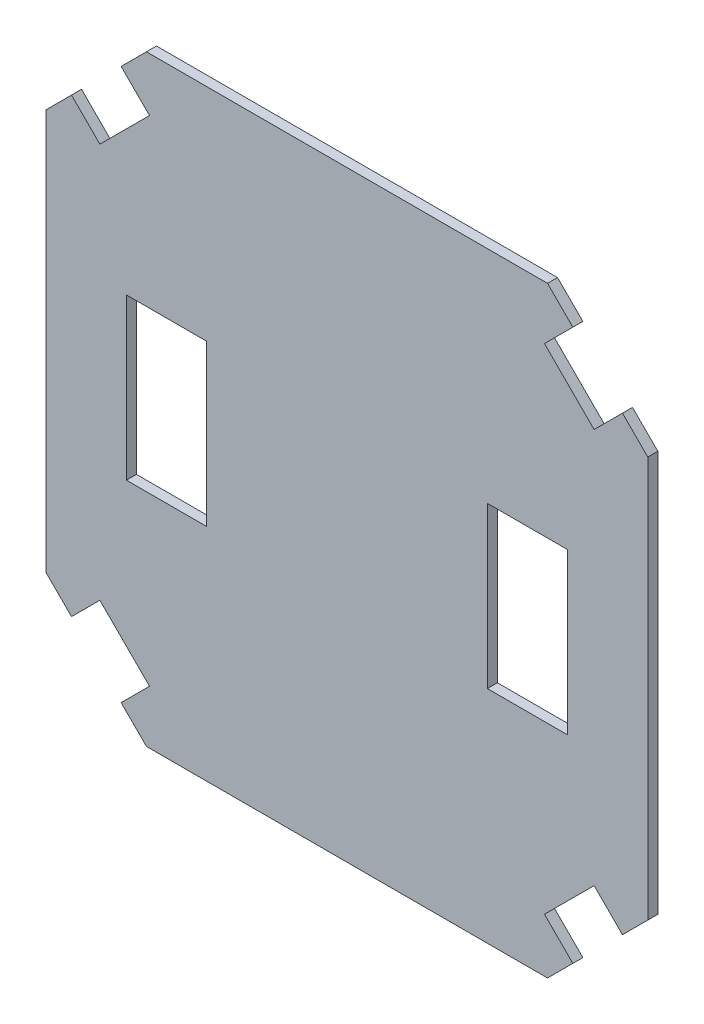
ISO-10303-21;
HEADER;
FILE_DESCRIPTION(('STEP AP214'),'2;1');
FILE_NAME('part.step','',(''),(''),'','','');
FILE_SCHEMA(('AUTOMOTIVE_DESIGN { 1 0 10303 214 1 1 1 1 }'));
ENDSEC;
DATA;
#1=APPLICATION_CONTEXT('core data for automotive mechanical design processes');
#2=APPLICATION_PROTOCOL_DEFINITION('international standard','automotive_design',2000,#1);
#3=PRODUCT_CONTEXT('',#1,'mechanical');
#4=PRODUCT('Part','Part','',(#3));
#5=PRODUCT_RELATED_PRODUCT_CATEGORY('part','',(#4));
#6=PRODUCT_DEFINITION_FORMATION('','',#4);
#7=PRODUCT_DEFINITION_CONTEXT('part definition',#1,'design');
#8=PRODUCT_DEFINITION('design','',#6,#7);
#9=PRODUCT_DEFINITION_SHAPE('','',#8);
#10=(LENGTH_UNIT() NAMED_UNIT(*) SI_UNIT(.MILLI.,.METRE.));
#11=(NAMED_UNIT(*) PLANE_ANGLE_UNIT() SI_UNIT($,.RADIAN.));
#12=(NAMED_UNIT(*) SI_UNIT($,.STERADIAN.) SOLID_ANGLE_UNIT());
#13=UNCERTAINTY_MEASURE_WITH_UNIT(LENGTH_MEASURE(1.E-05),#10,'distance_accuracy_value','');
#14=(GEOMETRIC_REPRESENTATION_CONTEXT(3) GLOBAL_UNCERTAINTY_ASSIGNED_CONTEXT((#13)) GLOBAL_UNIT_ASSIGNED_CONTEXT((#10,
#11,#12)) REPRESENTATION_CONTEXT('',''));
#15=CARTESIAN_POINT('',(0.,0.,0.));
#16=DIRECTION('',(0.,0.,1.));
#17=DIRECTION('',(1.,0.,0.));
#18=AXIS2_PLACEMENT_3D('',#15,#16,#17);
#19=CARTESIAN_POINT('',(0.,-40.,5.));
#20=DIRECTION('',(0.,1.,0.));
#21=DIRECTION('',(-1.,0.,0.));
#22=AXIS2_PLACEMENT_3D('',#19,#20,#21);
#23=PLANE('',#22);
#24=DIRECTION('',(1.,0.,0.));
#25=VECTOR('',#24,1.);
#26=CARTESIAN_POINT('',(0.,-40.,0.));
#27=LINE('',#26,#25);
#28=CARTESIAN_POINT('',(70.,-40.,0.));
#29=VERTEX_POINT('',#28);
#30=CARTESIAN_POINT('',(110.,-40.,0.));
#31=VERTEX_POINT('',#30);
#32=EDGE_CURVE('E482',#29,#31,#27,.T.);
#33=ORIENTED_EDGE('',*,*,#32,.F.);
#34=DIRECTION('',(0.,0.,-1.));
#35=VECTOR('',#34,1.);
#36=CARTESIAN_POINT('',(70.,-40.,5.));
#37=LINE('',#36,#35);
#38=CARTESIAN_POINT('',(70.,-40.,5.));
#39=VERTEX_POINT('',#38);
#40=EDGE_CURVE('E11',#39,#29,#37,.T.);
#41=ORIENTED_EDGE('',*,*,#40,.F.);
#42=DIRECTION('',(1.,0.,0.));
#43=VECTOR('',#42,1.);
#44=CARTESIAN_POINT('',(0.,-40.,5.));
#45=LINE('',#44,#43);
#46=CARTESIAN_POINT('',(110.,-40.,5.));
#47=VERTEX_POINT('',#46);
#48=EDGE_CURVE('E272',#39,#47,#45,.T.);
#49=ORIENTED_EDGE('',*,*,#48,.T.);
#50=DIRECTION('',(0.,0.,-1.));
#51=VECTOR('',#50,1.);
#52=CARTESIAN_POINT('',(110.,-40.,5.));
#53=LINE('',#52,#51);
#54=EDGE_CURVE('E61',#47,#31,#53,.T.);
#55=ORIENTED_EDGE('',*,*,#54,.T.);
#56=EDGE_LOOP('',(#33,#41,#49,#55));
#57=FACE_BOUND('',#56,.T.);
#58=ADVANCED_FACE('F41',(#57),#23,.T.);
#59=CARTESIAN_POINT('',(70.,0.,5.));
#60=DIRECTION('',(-1.,0.,0.));
#61=DIRECTION('',(0.,0.,1.));
#62=AXIS2_PLACEMENT_3D('',#59,#60,#61);
#63=PLANE('',#62);
#64=DIRECTION('',(0.,1.,0.));
#65=VECTOR('',#64,1.);
#66=CARTESIAN_POINT('',(70.,0.,0.));
#67=LINE('',#66,#65);
#68=CARTESIAN_POINT('',(70.,40.,0.));
#69=VERTEX_POINT('',#68);
#70=EDGE_CURVE('E278',#29,#69,#67,.T.);
#71=ORIENTED_EDGE('',*,*,#70,.T.);
#72=DIRECTION('',(0.,0.,-1.));
#73=VECTOR('',#72,1.);
#74=CARTESIAN_POINT('',(70.,40.,5.));
#75=LINE('',#74,#73);
#76=CARTESIAN_POINT('',(70.,40.,5.));
#77=VERTEX_POINT('',#76);
#78=EDGE_CURVE('E52',#77,#69,#75,.T.);
#79=ORIENTED_EDGE('',*,*,#78,.F.);
#80=DIRECTION('',(0.,1.,0.));
#81=VECTOR('',#80,1.);
#82=CARTESIAN_POINT('',(70.,0.,5.));
#83=LINE('',#82,#81);
#84=EDGE_CURVE('E267',#39,#77,#83,.T.);
#85=ORIENTED_EDGE('',*,*,#84,.F.);
#86=ORIENTED_EDGE('',*,*,#40,.T.);
#87=EDGE_LOOP('',(#71,#79,#85,#86));
#88=FACE_BOUND('',#87,.T.);
#89=ADVANCED_FACE('F276',(#88),#63,.F.);
#90=CARTESIAN_POINT('',(0.,40.,5.));
#91=DIRECTION('',(0.,1.,0.));
#92=DIRECTION('',(-1.,0.,0.));
#93=AXIS2_PLACEMENT_3D('',#90,#91,#92);
#94=PLANE('',#93);
#95=DIRECTION('',(1.,0.,0.));
#96=VECTOR('',#95,1.);
#97=CARTESIAN_POINT('',(0.,40.,0.));
#98=LINE('',#97,#96);
#99=CARTESIAN_POINT('',(110.,40.,0.));
#100=VERTEX_POINT('',#99);
#101=EDGE_CURVE('E487',#69,#100,#98,.T.);
#102=ORIENTED_EDGE('',*,*,#101,.T.);
#103=DIRECTION('',(0.,0.,-1.));
#104=VECTOR('',#103,1.);
#105=CARTESIAN_POINT('',(110.,40.,5.));
#106=LINE('',#105,#104);
#107=CARTESIAN_POINT('',(110.,40.,5.));
#108=VERTEX_POINT('',#107);
#109=EDGE_CURVE('E159',#108,#100,#106,.T.);
#110=ORIENTED_EDGE('',*,*,#109,.F.);
#111=DIRECTION('',(1.,0.,0.));
#112=VECTOR('',#111,1.);
#113=CARTESIAN_POINT('',(0.,40.,5.));
#114=LINE('',#113,#112);
#115=EDGE_CURVE('E258',#77,#108,#114,.T.);
#116=ORIENTED_EDGE('',*,*,#115,.F.);
#117=ORIENTED_EDGE('',*,*,#78,.T.);
#118=EDGE_LOOP('',(#102,#110,#116,#117));
#119=FACE_BOUND('',#118,.T.);
#120=ADVANCED_FACE('F260',(#119),#94,.F.);
#121=CARTESIAN_POINT('',(0.,-40.,5.));
#122=DIRECTION('',(0.,-1.,0.));
#123=DIRECTION('',(1.,0.,0.));
#124=AXIS2_PLACEMENT_3D('',#121,#122,#123);
#125=PLANE('',#124);
#126=DIRECTION('',(-1.,0.,0.));
#127=VECTOR('',#126,1.);
#128=CARTESIAN_POINT('',(0.,-40.,0.));
#129=LINE('',#128,#127);
#130=CARTESIAN_POINT('',(-70.,-40.,0.));
#131=VERTEX_POINT('',#130);
#132=CARTESIAN_POINT('',(-110.,-40.,0.));
#133=VERTEX_POINT('',#132);
#134=EDGE_CURVE('E466',#131,#133,#129,.T.);
#135=ORIENTED_EDGE('',*,*,#134,.T.);
#136=DIRECTION('',(0.,0.,-1.));
#137=VECTOR('',#136,1.);
#138=CARTESIAN_POINT('',(-110.,-40.,5.));
#139=LINE('',#138,#137);
#140=CARTESIAN_POINT('',(-110.,-40.,5.));
#141=VERTEX_POINT('',#140);
#142=EDGE_CURVE('E294',#141,#133,#139,.T.);
#143=ORIENTED_EDGE('',*,*,#142,.F.);
#144=DIRECTION('',(-1.,0.,0.));
#145=VECTOR('',#144,1.);
#146=CARTESIAN_POINT('',(0.,-40.,5.));
#147=LINE('',#146,#145);
#148=CARTESIAN_POINT('',(-70.,-40.,5.));
#149=VERTEX_POINT('',#148);
#150=EDGE_CURVE('E568',#149,#141,#147,.T.);
#151=ORIENTED_EDGE('',*,*,#150,.F.);
#152=DIRECTION('',(0.,0.,-1.));
#153=VECTOR('',#152,1.);
#154=CARTESIAN_POINT('',(-70.,-40.,5.));
#155=LINE('',#154,#153);
#156=EDGE_CURVE('E285',#149,#131,#155,.T.);
#157=ORIENTED_EDGE('',*,*,#156,.T.);
#158=EDGE_LOOP('',(#135,#143,#151,#157));
#159=FACE_BOUND('',#158,.T.);
#160=ADVANCED_FACE('F618',(#159),#125,.F.);
#161=CARTESIAN_POINT('',(-110.,0.,5.));
#162=DIRECTION('',(-1.,0.,0.));
#163=DIRECTION('',(0.,0.,1.));
#164=AXIS2_PLACEMENT_3D('',#161,#162,#163);
#165=PLANE('',#164);
#166=DIRECTION('',(0.,1.,0.));
#167=VECTOR('',#166,1.);
#168=CARTESIAN_POINT('',(-110.,0.,0.));
#169=LINE('',#168,#167);
#170=CARTESIAN_POINT('',(-110.,40.,0.));
#171=VERTEX_POINT('',#170);
#172=EDGE_CURVE('E470',#133,#171,#169,.T.);
#173=ORIENTED_EDGE('',*,*,#172,.T.);
#174=DIRECTION('',(0.,0.,-1.));
#175=VECTOR('',#174,1.);
#176=CARTESIAN_POINT('',(-110.,40.,5.));
#177=LINE('',#176,#175);
#178=CARTESIAN_POINT('',(-110.,40.,5.));
#179=VERTEX_POINT('',#178);
#180=EDGE_CURVE('E291',#179,#171,#177,.T.);
#181=ORIENTED_EDGE('',*,*,#180,.F.);
#182=DIRECTION('',(0.,1.,0.));
#183=VECTOR('',#182,1.);
#184=CARTESIAN_POINT('',(-110.,0.,5.));
#185=LINE('',#184,#183);
#186=EDGE_CURVE('E572',#141,#179,#185,.T.);
#187=ORIENTED_EDGE('',*,*,#186,.F.);
#188=ORIENTED_EDGE('',*,*,#142,.T.);
#189=EDGE_LOOP('',(#173,#181,#187,#188));
#190=FACE_BOUND('',#189,.T.);
#191=ADVANCED_FACE('F614',(#190),#165,.F.);
#192=CARTESIAN_POINT('',(0.,40.,5.));
#193=DIRECTION('',(0.,-1.,0.));
#194=DIRECTION('',(1.,0.,0.));
#195=AXIS2_PLACEMENT_3D('',#192,#193,#194);
#196=PLANE('',#195);
#197=DIRECTION('',(-1.,0.,0.));
#198=VECTOR('',#197,1.);
#199=CARTESIAN_POINT('',(0.,40.,0.));
#200=LINE('',#199,#198);
#201=CARTESIAN_POINT('',(-70.,40.,0.));
#202=VERTEX_POINT('',#201);
#203=EDGE_CURVE('E474',#202,#171,#200,.T.);
#204=ORIENTED_EDGE('',*,*,#203,.F.);
#205=DIRECTION('',(0.,0.,-1.));
#206=VECTOR('',#205,1.);
#207=CARTESIAN_POINT('',(-70.,40.,5.));
#208=LINE('',#207,#206);
#209=CARTESIAN_POINT('',(-70.,40.,5.));
#210=VERTEX_POINT('',#209);
#211=EDGE_CURVE('E288',#210,#202,#208,.T.);
#212=ORIENTED_EDGE('',*,*,#211,.F.);
#213=DIRECTION('',(-1.,0.,0.));
#214=VECTOR('',#213,1.);
#215=CARTESIAN_POINT('',(0.,40.,5.));
#216=LINE('',#215,#214);
#217=EDGE_CURVE('E575',#210,#179,#216,.T.);
#218=ORIENTED_EDGE('',*,*,#217,.T.);
#219=ORIENTED_EDGE('',*,*,#180,.T.);
#220=EDGE_LOOP('',(#204,#212,#218,#219));
#221=FACE_BOUND('',#220,.T.);
#222=ADVANCED_FACE('F611',(#221),#196,.T.);
#223=CARTESIAN_POINT('',(110.857864376269,-110.85786437627,5.));
#224=DIRECTION('',(0.707106781186543,-0.707106781186552,0.));
#225=DIRECTION('',(0.707106781186552,0.707106781186543,0.));
#226=AXIS2_PLACEMENT_3D('',#223,#224,#225);
#227=PLANE('',#226);
#228=DIRECTION('',(-0.707106781186552,-0.707106781186543,0.));
#229=VECTOR('',#228,1.);
#230=CARTESIAN_POINT('',(110.857864376269,-110.85786437627,0.));
#231=LINE('',#230,#229);
#232=CARTESIAN_POINT('',(123.232233047034,-98.4834957055048,0.));
#233=VERTEX_POINT('',#232);
#234=CARTESIAN_POINT('',(98.4834957055044,-123.232233047034,0.));
#235=VERTEX_POINT('',#234);
#236=EDGE_CURVE('E384',#233,#235,#231,.T.);
#237=ORIENTED_EDGE('',*,*,#236,.F.);
#238=DIRECTION('',(0.,0.,-1.));
#239=VECTOR('',#238,1.);
#240=CARTESIAN_POINT('',(123.232233047034,-98.4834957055048,5.));
#241=LINE('',#240,#239);
#242=CARTESIAN_POINT('',(123.232233047034,-98.4834957055048,5.));
#243=VERTEX_POINT('',#242);
#244=EDGE_CURVE('E45',#243,#233,#241,.T.);
#245=ORIENTED_EDGE('',*,*,#244,.F.);
#246=DIRECTION('',(-0.707106781186552,-0.707106781186543,0.));
#247=VECTOR('',#246,1.);
#248=CARTESIAN_POINT('',(110.857864376269,-110.85786437627,5.));
#249=LINE('',#248,#247);
#250=CARTESIAN_POINT('',(98.4834957055044,-123.232233047034,5.));
#251=VERTEX_POINT('',#250);
#252=EDGE_CURVE('E493',#243,#251,#249,.T.);
#253=ORIENTED_EDGE('',*,*,#252,.T.);
#254=DIRECTION('',(0.,0.,-1.));
#255=VECTOR('',#254,1.);
#256=CARTESIAN_POINT('',(98.4834957055044,-123.232233047034,5.));
#257=LINE('',#256,#255);
#258=EDGE_CURVE('E298',#251,#235,#257,.T.);
#259=ORIENTED_EDGE('',*,*,#258,.T.);
#260=EDGE_LOOP('',(#237,#245,#253,#259));
#261=FACE_BOUND('',#260,.T.);
#262=ADVANCED_FACE('F43',(#261),#227,.T.);
#263=CARTESIAN_POINT('',(12.3743686707649,12.3743686707648,5.));
#264=DIRECTION('',(-0.70710678118655,-0.707106781186545,0.));
#265=DIRECTION('',(0.707106781186545,-0.70710678118655,0.));
#266=AXIS2_PLACEMENT_3D('',#263,#264,#265);
#267=PLANE('',#266);
#268=DIRECTION('',(-0.707106781186545,0.70710678118655,0.));
#269=VECTOR('',#268,1.);
#270=CARTESIAN_POINT('',(12.3743686707649,12.3743686707648,0.));
#271=LINE('',#270,#269);
#272=CARTESIAN_POINT('',(137.374368670765,-112.625631329236,0.));
#273=VERTEX_POINT('',#272);
#274=EDGE_CURVE('E380',#273,#233,#271,.T.);
#275=ORIENTED_EDGE('',*,*,#274,.F.);
#276=DIRECTION('',(0.,0.,-1.));
#277=VECTOR('',#276,1.);
#278=CARTESIAN_POINT('',(137.374368670765,-112.625631329236,5.));
#279=LINE('',#278,#277);
#280=CARTESIAN_POINT('',(137.374368670765,-112.625631329236,5.));
#281=VERTEX_POINT('',#280);
#282=EDGE_CURVE('E369',#281,#273,#279,.T.);
#283=ORIENTED_EDGE('',*,*,#282,.F.);
#284=DIRECTION('',(-0.707106781186545,0.70710678118655,0.));
#285=VECTOR('',#284,1.);
#286=CARTESIAN_POINT('',(12.3743686707649,12.3743686707648,5.));
#287=LINE('',#286,#285);
#288=EDGE_CURVE('E382',#281,#243,#287,.T.);
#289=ORIENTED_EDGE('',*,*,#288,.T.);
#290=ORIENTED_EDGE('',*,*,#244,.T.);
#291=EDGE_LOOP('',(#275,#283,#289,#290));
#292=FACE_BOUND('',#291,.T.);
#293=ADVANCED_FACE('F378',(#292),#267,.T.);
#294=CARTESIAN_POINT('',(124.999999999999,-125.000000000001,5.));
#295=DIRECTION('',(-0.707106781186544,0.707106781186552,0.));
#296=DIRECTION('',(-0.707106781186551,-0.707106781186544,0.));
#297=AXIS2_PLACEMENT_3D('',#294,#295,#296);
#298=PLANE('',#297);
#299=DIRECTION('',(0.707106781186552,0.707106781186544,0.));
#300=VECTOR('',#299,1.);
#301=CARTESIAN_POINT('',(124.999999999999,-125.000000000001,0.));
#302=LINE('',#301,#300);
#303=CARTESIAN_POINT('',(150.,-100.000000000001,0.));
#304=VERTEX_POINT('',#303);
#305=EDGE_CURVE('E393',#273,#304,#302,.T.);
#306=ORIENTED_EDGE('',*,*,#305,.T.);
#307=DIRECTION('',(0.,0.,-1.));
#308=VECTOR('',#307,1.);
#309=CARTESIAN_POINT('',(150.,-100.000000000001,5.));
#310=LINE('',#309,#308);
#311=CARTESIAN_POINT('',(150.,-100.000000000001,5.));
#312=VERTEX_POINT('',#311);
#313=EDGE_CURVE('E366',#312,#304,#310,.T.);
#314=ORIENTED_EDGE('',*,*,#313,.F.);
#315=DIRECTION('',(0.707106781186552,0.707106781186544,0.));
#316=VECTOR('',#315,1.);
#317=CARTESIAN_POINT('',(124.999999999999,-125.000000000001,5.));
#318=LINE('',#317,#316);
#319=EDGE_CURVE('E500',#281,#312,#318,.T.);
#320=ORIENTED_EDGE('',*,*,#319,.F.);
#321=ORIENTED_EDGE('',*,*,#282,.T.);
#322=EDGE_LOOP('',(#306,#314,#320,#321));
#323=FACE_BOUND('',#322,.T.);
#324=ADVANCED_FACE('F627',(#323),#298,.F.);
#325=CARTESIAN_POINT('',(150.,0.,5.));
#326=DIRECTION('',(-1.,0.,0.));
#327=DIRECTION('',(0.,0.,1.));
#328=AXIS2_PLACEMENT_3D('',#325,#326,#327);
#329=PLANE('',#328);
#330=DIRECTION('',(0.,1.,0.));
#331=VECTOR('',#330,1.);
#332=CARTESIAN_POINT('',(150.,0.,0.));
#333=LINE('',#332,#331);
#334=CARTESIAN_POINT('',(150.,100.000000000001,0.));
#335=VERTEX_POINT('',#334);
#336=EDGE_CURVE('E397',#304,#335,#333,.T.);
#337=ORIENTED_EDGE('',*,*,#336,.T.);
#338=DIRECTION('',(0.,0.,-1.));
#339=VECTOR('',#338,1.);
#340=CARTESIAN_POINT('',(150.,100.000000000001,5.));
#341=LINE('',#340,#339);
#342=CARTESIAN_POINT('',(150.,100.000000000001,5.));
#343=VERTEX_POINT('',#342);
#344=EDGE_CURVE('E363',#343,#335,#341,.T.);
#345=ORIENTED_EDGE('',*,*,#344,.F.);
#346=DIRECTION('',(0.,1.,0.));
#347=VECTOR('',#346,1.);
#348=CARTESIAN_POINT('',(150.,0.,5.));
#349=LINE('',#348,#347);
#350=EDGE_CURVE('E505',#312,#343,#349,.T.);
#351=ORIENTED_EDGE('',*,*,#350,.F.);
#352=ORIENTED_EDGE('',*,*,#313,.T.);
#353=EDGE_LOOP('',(#337,#345,#351,#352));
#354=FACE_BOUND('',#353,.T.);
#355=ADVANCED_FACE('F690',(#354),#329,.F.);
#356=CARTESIAN_POINT('',(124.999999999999,125.000000000001,5.));
#357=DIRECTION('',(0.707106781186544,0.707106781186552,0.));
#358=DIRECTION('',(-0.707106781186551,0.707106781186544,0.));
#359=AXIS2_PLACEMENT_3D('',#356,#357,#358);
#360=PLANE('',#359);
#361=DIRECTION('',(0.707106781186552,-0.707106781186544,0.));
#362=VECTOR('',#361,1.);
#363=CARTESIAN_POINT('',(124.999999999999,125.000000000001,0.));
#364=LINE('',#363,#362);
#365=CARTESIAN_POINT('',(137.374368670765,112.625631329236,0.));
#366=VERTEX_POINT('',#365);
#367=EDGE_CURVE('E405',#366,#335,#364,.T.);
#368=ORIENTED_EDGE('',*,*,#367,.F.);
#369=DIRECTION('',(0.,0.,-1.));
#370=VECTOR('',#369,1.);
#371=CARTESIAN_POINT('',(137.374368670765,112.625631329236,5.));
#372=LINE('',#371,#370);
#373=CARTESIAN_POINT('',(137.374368670765,112.625631329236,5.));
#374=VERTEX_POINT('',#373);
#375=EDGE_CURVE('E360',#374,#366,#372,.T.);
#376=ORIENTED_EDGE('',*,*,#375,.F.);
#377=DIRECTION('',(0.707106781186552,-0.707106781186544,0.));
#378=VECTOR('',#377,1.);
#379=CARTESIAN_POINT('',(124.999999999999,125.000000000001,5.));
#380=LINE('',#379,#378);
#381=EDGE_CURVE('E509',#374,#343,#380,.T.);
#382=ORIENTED_EDGE('',*,*,#381,.T.);
#383=ORIENTED_EDGE('',*,*,#344,.T.);
#384=EDGE_LOOP('',(#368,#376,#382,#383));
#385=FACE_BOUND('',#384,.T.);
#386=ADVANCED_FACE('F678',(#385),#360,.T.);
#387=CARTESIAN_POINT('',(12.3743686707649,-12.3743686707648,5.));
#388=DIRECTION('',(0.70710678118655,-0.707106781186545,0.));
#389=DIRECTION('',(0.707106781186545,0.70710678118655,0.));
#390=AXIS2_PLACEMENT_3D('',#387,#388,#389);
#391=PLANE('',#390);
#392=DIRECTION('',(-0.707106781186545,-0.70710678118655,0.));
#393=VECTOR('',#392,1.);
#394=CARTESIAN_POINT('',(12.3743686707649,-12.3743686707648,0.));
#395=LINE('',#394,#393);
#396=CARTESIAN_POINT('',(123.232233047034,98.4834957055048,0.));
#397=VERTEX_POINT('',#396);
#398=EDGE_CURVE('E409',#366,#397,#395,.T.);
#399=ORIENTED_EDGE('',*,*,#398,.T.);
#400=DIRECTION('',(0.,0.,-1.));
#401=VECTOR('',#400,1.);
#402=CARTESIAN_POINT('',(123.232233047034,98.4834957055048,5.));
#403=LINE('',#402,#401);
#404=CARTESIAN_POINT('',(123.232233047034,98.4834957055048,5.));
#405=VERTEX_POINT('',#404);
#406=EDGE_CURVE('E356',#405,#397,#403,.T.);
#407=ORIENTED_EDGE('',*,*,#406,.F.);
#408=DIRECTION('',(-0.707106781186545,-0.70710678118655,0.));
#409=VECTOR('',#408,1.);
#410=CARTESIAN_POINT('',(12.3743686707649,-12.3743686707648,5.));
#411=LINE('',#410,#409);
#412=EDGE_CURVE('E513',#374,#405,#411,.T.);
#413=ORIENTED_EDGE('',*,*,#412,.F.);
#414=ORIENTED_EDGE('',*,*,#375,.T.);
#415=EDGE_LOOP('',(#399,#407,#413,#414));
#416=FACE_BOUND('',#415,.T.);
#417=ADVANCED_FACE('F685',(#416),#391,.F.);
#418=CARTESIAN_POINT('',(110.857864376269,110.85786437627,5.));
#419=DIRECTION('',(-0.707106781186543,-0.707106781186552,0.));
#420=DIRECTION('',(0.707106781186552,-0.707106781186543,0.));
#421=AXIS2_PLACEMENT_3D('',#418,#419,#420);
#422=PLANE('',#421);
#423=DIRECTION('',(-0.707106781186552,0.707106781186543,0.));
#424=VECTOR('',#423,1.);
#425=CARTESIAN_POINT('',(110.857864376269,110.85786437627,0.));
#426=LINE('',#425,#424);
#427=CARTESIAN_POINT('',(98.4834957055045,123.232233047034,0.));
#428=VERTEX_POINT('',#427);
#429=EDGE_CURVE('E413',#397,#428,#426,.T.);
#430=ORIENTED_EDGE('',*,*,#429,.T.);
#431=DIRECTION('',(0.,0.,-1.));
#432=VECTOR('',#431,1.);
#433=CARTESIAN_POINT('',(98.4834957055045,123.232233047034,5.));
#434=LINE('',#433,#432);
#435=CARTESIAN_POINT('',(98.4834957055045,123.232233047034,5.));
#436=VERTEX_POINT('',#435);
#437=EDGE_CURVE('E352',#436,#428,#434,.T.);
#438=ORIENTED_EDGE('',*,*,#437,.F.);
#439=DIRECTION('',(-0.707106781186552,0.707106781186543,0.));
#440=VECTOR('',#439,1.);
#441=CARTESIAN_POINT('',(110.857864376269,110.85786437627,5.));
#442=LINE('',#441,#440);
#443=EDGE_CURVE('E517',#405,#436,#442,.T.);
#444=ORIENTED_EDGE('',*,*,#443,.F.);
#445=ORIENTED_EDGE('',*,*,#406,.T.);
#446=EDGE_LOOP('',(#430,#438,#444,#445));
#447=FACE_BOUND('',#446,.T.);
#448=ADVANCED_FACE('F681',(#447),#422,.F.);
#449=CARTESIAN_POINT('',(-12.3743686707643,12.3743686707642,5.));
#450=DIRECTION('',(-0.707106781186551,0.707106781186544,0.));
#451=DIRECTION('',(-0.707106781186544,-0.707106781186551,0.));
#452=AXIS2_PLACEMENT_3D('',#449,#450,#451);
#453=PLANE('',#452);
#454=DIRECTION('',(0.707106781186544,0.707106781186551,0.));
#455=VECTOR('',#454,1.);
#456=CARTESIAN_POINT('',(-12.3743686707643,12.3743686707642,0.));
#457=LINE('',#456,#455);
#458=CARTESIAN_POINT('',(112.625631329235,137.374368670765,0.));
#459=VERTEX_POINT('',#458);
#460=EDGE_CURVE('E416',#428,#459,#457,.T.);
#461=ORIENTED_EDGE('',*,*,#460,.T.);
#462=DIRECTION('',(0.,0.,-1.));
#463=VECTOR('',#462,1.);
#464=CARTESIAN_POINT('',(112.625631329235,137.374368670765,5.));
#465=LINE('',#464,#463);
#466=CARTESIAN_POINT('',(112.625631329235,137.374368670765,5.));
#467=VERTEX_POINT('',#466);
#468=EDGE_CURVE('E349',#467,#459,#465,.T.);
#469=ORIENTED_EDGE('',*,*,#468,.F.);
#470=DIRECTION('',(0.707106781186544,0.707106781186551,0.));
#471=VECTOR('',#470,1.);
#472=CARTESIAN_POINT('',(-12.3743686707643,12.3743686707642,5.));
#473=LINE('',#472,#471);
#474=EDGE_CURVE('E520',#436,#467,#473,.T.);
#475=ORIENTED_EDGE('',*,*,#474,.F.);
#476=ORIENTED_EDGE('',*,*,#437,.T.);
#477=EDGE_LOOP('',(#461,#469,#475,#476));
#478=FACE_BOUND('',#477,.T.);
#479=ADVANCED_FACE('F676',(#478),#453,.F.);
#480=CARTESIAN_POINT('',(100.,150.,0.));
#481=VERTEX_POINT('',#480);
#482=EDGE_CURVE('E410',#481,#459,#364,.T.);
#483=ORIENTED_EDGE('',*,*,#482,.F.);
#484=DIRECTION('',(0.,0.,-1.));
#485=VECTOR('',#484,1.);
#486=CARTESIAN_POINT('',(100.,150.,5.));
#487=LINE('',#486,#485);
#488=CARTESIAN_POINT('',(100.,150.,5.));
#489=VERTEX_POINT('',#488);
#490=EDGE_CURVE('E346',#489,#481,#487,.T.);
#491=ORIENTED_EDGE('',*,*,#490,.F.);
#492=EDGE_CURVE('E514',#489,#467,#380,.T.);
#493=ORIENTED_EDGE('',*,*,#492,.T.);
#494=ORIENTED_EDGE('',*,*,#468,.T.);
#495=EDGE_LOOP('',(#483,#491,#493,#494));
#496=FACE_BOUND('',#495,.T.);
#497=ADVANCED_FACE('F672',(#496),#360,.T.);
#498=CARTESIAN_POINT('',(0.,150.,5.));
#499=DIRECTION('',(0.,-1.,0.));
#500=DIRECTION('',(1.,0.,0.));
#501=AXIS2_PLACEMENT_3D('',#498,#499,#500);
#502=PLANE('',#501);
#503=DIRECTION('',(-1.,0.,0.));
#504=VECTOR('',#503,1.);
#505=CARTESIAN_POINT('',(0.,150.,0.));
#506=LINE('',#505,#504);
#507=CARTESIAN_POINT('',(-100.,150.,0.));
#508=VERTEX_POINT('',#507);
#509=EDGE_CURVE('E420',#481,#508,#506,.T.);
#510=ORIENTED_EDGE('',*,*,#509,.T.);
#511=DIRECTION('',(0.,0.,-1.));
#512=VECTOR('',#511,1.);
#513=CARTESIAN_POINT('',(-100.,150.,5.));
#514=LINE('',#513,#512);
#515=CARTESIAN_POINT('',(-100.,150.,5.));
#516=VERTEX_POINT('',#515);
#517=EDGE_CURVE('E342',#516,#508,#514,.T.);
#518=ORIENTED_EDGE('',*,*,#517,.F.);
#519=DIRECTION('',(-1.,0.,0.));
#520=VECTOR('',#519,1.);
#521=CARTESIAN_POINT('',(0.,150.,5.));
#522=LINE('',#521,#520);
#523=EDGE_CURVE('E523',#489,#516,#522,.T.);
#524=ORIENTED_EDGE('',*,*,#523,.F.);
#525=ORIENTED_EDGE('',*,*,#490,.T.);
#526=EDGE_LOOP('',(#510,#518,#524,#525));
#527=FACE_BOUND('',#526,.T.);
#528=ADVANCED_FACE('F669',(#527),#502,.F.);
#529=CARTESIAN_POINT('',(-124.999999999999,125.000000000001,5.));
#530=DIRECTION('',(0.707106781186543,-0.707106781186552,0.));
#531=DIRECTION('',(0.707106781186552,0.707106781186543,0.));
#532=AXIS2_PLACEMENT_3D('',#529,#530,#531);
#533=PLANE('',#532);
#534=DIRECTION('',(-0.707106781186552,-0.707106781186543,0.));
#535=VECTOR('',#534,1.);
#536=CARTESIAN_POINT('',(-124.999999999999,125.000000000001,0.));
#537=LINE('',#536,#535);
#538=CARTESIAN_POINT('',(-112.625631329235,137.374368670765,0.));
#539=VERTEX_POINT('',#538);
#540=EDGE_CURVE('E423',#508,#539,#537,.T.);
#541=ORIENTED_EDGE('',*,*,#540,.T.);
#542=DIRECTION('',(0.,0.,-1.));
#543=VECTOR('',#542,1.);
#544=CARTESIAN_POINT('',(-112.625631329235,137.374368670765,5.));
#545=LINE('',#544,#543);
#546=CARTESIAN_POINT('',(-112.625631329235,137.374368670765,5.));
#547=VERTEX_POINT('',#546);
#548=EDGE_CURVE('E339',#547,#539,#545,.T.);
#549=ORIENTED_EDGE('',*,*,#548,.F.);
#550=DIRECTION('',(-0.707106781186552,-0.707106781186543,0.));
#551=VECTOR('',#550,1.);
#552=CARTESIAN_POINT('',(-124.999999999999,125.000000000001,5.));
#553=LINE('',#552,#551);
#554=EDGE_CURVE('E526',#516,#547,#553,.T.);
#555=ORIENTED_EDGE('',*,*,#554,.F.);
#556=ORIENTED_EDGE('',*,*,#517,.T.);
#557=EDGE_LOOP('',(#541,#549,#555,#556));
#558=FACE_BOUND('',#557,.T.);
#559=ADVANCED_FACE('F657',(#558),#533,.F.);
#560=CARTESIAN_POINT('',(12.3743686707643,12.3743686707642,5.));
#561=DIRECTION('',(-0.707106781186551,-0.707106781186544,0.));
#562=DIRECTION('',(0.707106781186544,-0.707106781186551,0.));
#563=AXIS2_PLACEMENT_3D('',#560,#561,#562);
#564=PLANE('',#563);
#565=DIRECTION('',(-0.707106781186544,0.707106781186551,0.));
#566=VECTOR('',#565,1.);
#567=CARTESIAN_POINT('',(12.3743686707643,12.3743686707642,0.));
#568=LINE('',#567,#566);
#569=CARTESIAN_POINT('',(-98.4834957055044,123.232233047034,0.));
#570=VERTEX_POINT('',#569);
#571=EDGE_CURVE('E427',#570,#539,#568,.T.);
#572=ORIENTED_EDGE('',*,*,#571,.F.);
#573=DIRECTION('',(0.,0.,-1.));
#574=VECTOR('',#573,1.);
#575=CARTESIAN_POINT('',(-98.4834957055044,123.232233047034,5.));
#576=LINE('',#575,#574);
#577=CARTESIAN_POINT('',(-98.4834957055044,123.232233047034,5.));
#578=VERTEX_POINT('',#577);
#579=EDGE_CURVE('E336',#578,#570,#576,.T.);
#580=ORIENTED_EDGE('',*,*,#579,.F.);
#581=DIRECTION('',(-0.707106781186544,0.707106781186551,0.));
#582=VECTOR('',#581,1.);
#583=CARTESIAN_POINT('',(12.3743686707643,12.3743686707642,5.));
#584=LINE('',#583,#582);
#585=EDGE_CURVE('E529',#578,#547,#584,.T.);
#586=ORIENTED_EDGE('',*,*,#585,.T.);
#587=ORIENTED_EDGE('',*,*,#548,.T.);
#588=EDGE_LOOP('',(#572,#580,#586,#587));
#589=FACE_BOUND('',#588,.T.);
#590=ADVANCED_FACE('F664',(#589),#564,.T.);
#591=CARTESIAN_POINT('',(-110.857864376268,110.857864376271,5.));
#592=DIRECTION('',(-0.707106781186539,0.707106781186556,0.));
#593=DIRECTION('',(-0.707106781186556,-0.707106781186539,0.));
#594=AXIS2_PLACEMENT_3D('',#591,#592,#593);
#595=PLANE('',#594);
#596=DIRECTION('',(0.707106781186556,0.707106781186539,0.));
#597=VECTOR('',#596,1.);
#598=CARTESIAN_POINT('',(-110.857864376268,110.857864376271,0.));
#599=LINE('',#598,#597);
#600=CARTESIAN_POINT('',(-123.232233047033,98.4834957055056,0.));
#601=VERTEX_POINT('',#600);
#602=EDGE_CURVE('E432',#601,#570,#599,.T.);
#603=ORIENTED_EDGE('',*,*,#602,.F.);
#604=DIRECTION('',(0.,0.,-1.));
#605=VECTOR('',#604,1.);
#606=CARTESIAN_POINT('',(-123.232233047033,98.4834957055056,5.));
#607=LINE('',#606,#605);
#608=CARTESIAN_POINT('',(-123.232233047033,98.4834957055056,5.));
#609=VERTEX_POINT('',#608);
#610=EDGE_CURVE('E333',#609,#601,#607,.T.);
#611=ORIENTED_EDGE('',*,*,#610,.F.);
#612=DIRECTION('',(0.707106781186556,0.707106781186539,0.));
#613=VECTOR('',#612,1.);
#614=CARTESIAN_POINT('',(-110.857864376268,110.857864376271,5.));
#615=LINE('',#614,#613);
#616=EDGE_CURVE('E534',#609,#578,#615,.T.);
#617=ORIENTED_EDGE('',*,*,#616,.T.);
#618=ORIENTED_EDGE('',*,*,#579,.T.);
#619=EDGE_LOOP('',(#603,#611,#617,#618));
#620=FACE_BOUND('',#619,.T.);
#621=ADVANCED_FACE('F660',(#620),#595,.T.);
#622=CARTESIAN_POINT('',(-12.3743686707646,-12.3743686707644,5.));
#623=DIRECTION('',(0.707106781186552,0.707106781186543,0.));
#624=DIRECTION('',(-0.707106781186543,0.707106781186552,0.));
#625=AXIS2_PLACEMENT_3D('',#622,#623,#624);
#626=PLANE('',#625);
#627=DIRECTION('',(0.707106781186543,-0.707106781186552,0.));
#628=VECTOR('',#627,1.);
#629=CARTESIAN_POINT('',(-12.3743686707646,-12.3743686707644,0.));
#630=LINE('',#629,#628);
#631=CARTESIAN_POINT('',(-137.374368670764,112.625631329237,0.));
#632=VERTEX_POINT('',#631);
#633=EDGE_CURVE('E436',#632,#601,#630,.T.);
#634=ORIENTED_EDGE('',*,*,#633,.F.);
#635=DIRECTION('',(0.,0.,-1.));
#636=VECTOR('',#635,1.);
#637=CARTESIAN_POINT('',(-137.374368670764,112.625631329237,5.));
#638=LINE('',#637,#636);
#639=CARTESIAN_POINT('',(-137.374368670764,112.625631329237,5.));
#640=VERTEX_POINT('',#639);
#641=EDGE_CURVE('E330',#640,#632,#638,.T.);
#642=ORIENTED_EDGE('',*,*,#641,.F.);
#643=DIRECTION('',(0.707106781186543,-0.707106781186552,0.));
#644=VECTOR('',#643,1.);
#645=CARTESIAN_POINT('',(-12.3743686707646,-12.3743686707644,5.));
#646=LINE('',#645,#644);
#647=EDGE_CURVE('E538',#640,#609,#646,.T.);
#648=ORIENTED_EDGE('',*,*,#647,.T.);
#649=ORIENTED_EDGE('',*,*,#610,.T.);
#650=EDGE_LOOP('',(#634,#642,#648,#649));
#651=FACE_BOUND('',#650,.T.);
#652=ADVANCED_FACE('F655',(#651),#626,.T.);
#653=CARTESIAN_POINT('',(-150.,100.000000000001,0.));
#654=VERTEX_POINT('',#653);
#655=EDGE_CURVE('E428',#632,#654,#537,.T.);
#656=ORIENTED_EDGE('',*,*,#655,.T.);
#657=DIRECTION('',(0.,0.,-1.));
#658=VECTOR('',#657,1.);
#659=CARTESIAN_POINT('',(-150.,100.000000000001,5.));
#660=LINE('',#659,#658);
#661=CARTESIAN_POINT('',(-150.,100.000000000001,5.));
#662=VERTEX_POINT('',#661);
#663=EDGE_CURVE('E327',#662,#654,#660,.T.);
#664=ORIENTED_EDGE('',*,*,#663,.F.);
#665=EDGE_CURVE('E530',#640,#662,#553,.T.);
#666=ORIENTED_EDGE('',*,*,#665,.F.);
#667=ORIENTED_EDGE('',*,*,#641,.T.);
#668=EDGE_LOOP('',(#656,#664,#666,#667));
#669=FACE_BOUND('',#668,.T.);
#670=ADVANCED_FACE('F651',(#669),#533,.F.);
#671=CARTESIAN_POINT('',(-150.,0.,5.));
#672=DIRECTION('',(-1.,0.,0.));
#673=DIRECTION('',(0.,0.,1.));
#674=AXIS2_PLACEMENT_3D('',#671,#672,#673);
#675=PLANE('',#674);
#676=DIRECTION('',(0.,1.,0.));
#677=VECTOR('',#676,1.);
#678=CARTESIAN_POINT('',(-150.,0.,0.));
#679=LINE('',#678,#677);
#680=CARTESIAN_POINT('',(-150.,-100.000000000001,0.));
#681=VERTEX_POINT('',#680);
#682=EDGE_CURVE('E440',#681,#654,#679,.T.);
#683=ORIENTED_EDGE('',*,*,#682,.F.);
#684=DIRECTION('',(0.,0.,-1.));
#685=VECTOR('',#684,1.);
#686=CARTESIAN_POINT('',(-150.,-100.000000000001,5.));
#687=LINE('',#686,#685);
#688=CARTESIAN_POINT('',(-150.,-100.000000000001,5.));
#689=VERTEX_POINT('',#688);
#690=EDGE_CURVE('E324',#689,#681,#687,.T.);
#691=ORIENTED_EDGE('',*,*,#690,.F.);
#692=DIRECTION('',(0.,1.,0.));
#693=VECTOR('',#692,1.);
#694=CARTESIAN_POINT('',(-150.,0.,5.));
#695=LINE('',#694,#693);
#696=EDGE_CURVE('E542',#689,#662,#695,.T.);
#697=ORIENTED_EDGE('',*,*,#696,.T.);
#698=ORIENTED_EDGE('',*,*,#663,.T.);
#699=EDGE_LOOP('',(#683,#691,#697,#698));
#700=FACE_BOUND('',#699,.T.);
#701=ADVANCED_FACE('F648',(#700),#675,.T.);
#702=CARTESIAN_POINT('',(-124.999999999999,-125.000000000001,5.));
#703=DIRECTION('',(-0.707106781186543,-0.707106781186552,0.));
#704=DIRECTION('',(0.707106781186552,-0.707106781186543,0.));
#705=AXIS2_PLACEMENT_3D('',#702,#703,#704);
#706=PLANE('',#705);
#707=DIRECTION('',(-0.707106781186552,0.707106781186543,0.));
#708=VECTOR('',#707,1.);
#709=CARTESIAN_POINT('',(-124.999999999999,-125.000000000001,0.));
#710=LINE('',#709,#708);
#711=CARTESIAN_POINT('',(-137.374368670765,-112.625631329236,0.));
#712=VERTEX_POINT('',#711);
#713=EDGE_CURVE('E444',#712,#681,#710,.T.);
#714=ORIENTED_EDGE('',*,*,#713,.F.);
#715=DIRECTION('',(0.,0.,-1.));
#716=VECTOR('',#715,1.);
#717=CARTESIAN_POINT('',(-137.374368670765,-112.625631329236,5.));
#718=LINE('',#717,#716);
#719=CARTESIAN_POINT('',(-137.374368670765,-112.625631329236,5.));
#720=VERTEX_POINT('',#719);
#721=EDGE_CURVE('E321',#720,#712,#718,.T.);
#722=ORIENTED_EDGE('',*,*,#721,.F.);
#723=DIRECTION('',(-0.707106781186552,0.707106781186543,0.));
#724=VECTOR('',#723,1.);
#725=CARTESIAN_POINT('',(-124.999999999999,-125.000000000001,5.));
#726=LINE('',#725,#724);
#727=EDGE_CURVE('E546',#720,#689,#726,.T.);
#728=ORIENTED_EDGE('',*,*,#727,.T.);
#729=ORIENTED_EDGE('',*,*,#690,.T.);
#730=EDGE_LOOP('',(#714,#722,#728,#729));
#731=FACE_BOUND('',#730,.T.);
#732=ADVANCED_FACE('F636',(#731),#706,.T.);
#733=CARTESIAN_POINT('',(-12.3743686707644,12.3743686707644,5.));
#734=DIRECTION('',(-0.707106781186547,0.707106781186548,0.));
#735=DIRECTION('',(-0.707106781186548,-0.707106781186547,0.));
#736=AXIS2_PLACEMENT_3D('',#733,#734,#735);
#737=PLANE('',#736);
#738=DIRECTION('',(0.707106781186548,0.707106781186547,0.));
#739=VECTOR('',#738,1.);
#740=CARTESIAN_POINT('',(-12.3743686707644,12.3743686707644,0.));
#741=LINE('',#740,#739);
#742=CARTESIAN_POINT('',(-123.232233047034,-98.4834957055048,0.));
#743=VERTEX_POINT('',#742);
#744=EDGE_CURVE('E448',#712,#743,#741,.T.);
#745=ORIENTED_EDGE('',*,*,#744,.T.);
#746=DIRECTION('',(0.,0.,-1.));
#747=VECTOR('',#746,1.);
#748=CARTESIAN_POINT('',(-123.232233047034,-98.4834957055048,5.));
#749=LINE('',#748,#747);
#750=CARTESIAN_POINT('',(-123.232233047034,-98.4834957055048,5.));
#751=VERTEX_POINT('',#750);
#752=EDGE_CURVE('E317',#751,#743,#749,.T.);
#753=ORIENTED_EDGE('',*,*,#752,.F.);
#754=DIRECTION('',(0.707106781186548,0.707106781186547,0.));
#755=VECTOR('',#754,1.);
#756=CARTESIAN_POINT('',(-12.3743686707644,12.3743686707644,5.));
#757=LINE('',#756,#755);
#758=EDGE_CURVE('E550',#720,#751,#757,.T.);
#759=ORIENTED_EDGE('',*,*,#758,.F.);
#760=ORIENTED_EDGE('',*,*,#721,.T.);
#761=EDGE_LOOP('',(#745,#753,#759,#760));
#762=FACE_BOUND('',#761,.T.);
#763=ADVANCED_FACE('F643',(#762),#737,.F.);
#764=CARTESIAN_POINT('',(-110.857864376269,-110.85786437627,5.));
#765=DIRECTION('',(0.707106781186544,0.707106781186551,0.));
#766=DIRECTION('',(-0.707106781186551,0.707106781186544,0.));
#767=AXIS2_PLACEMENT_3D('',#764,#765,#766);
#768=PLANE('',#767);
#769=DIRECTION('',(0.707106781186551,-0.707106781186544,0.));
#770=VECTOR('',#769,1.);
#771=CARTESIAN_POINT('',(-110.857864376269,-110.85786437627,0.));
#772=LINE('',#771,#770);
#773=CARTESIAN_POINT('',(-98.4834957055044,-123.232233047034,0.));
#774=VERTEX_POINT('',#773);
#775=EDGE_CURVE('E452',#743,#774,#772,.T.);
#776=ORIENTED_EDGE('',*,*,#775,.T.);
#777=DIRECTION('',(0.,0.,-1.));
#778=VECTOR('',#777,1.);
#779=CARTESIAN_POINT('',(-98.4834957055044,-123.232233047034,5.));
#780=LINE('',#779,#778);
#781=CARTESIAN_POINT('',(-98.4834957055044,-123.232233047034,5.));
#782=VERTEX_POINT('',#781);
#783=EDGE_CURVE('E313',#782,#774,#780,.T.);
#784=ORIENTED_EDGE('',*,*,#783,.F.);
#785=DIRECTION('',(0.707106781186551,-0.707106781186544,0.));
#786=VECTOR('',#785,1.);
#787=CARTESIAN_POINT('',(-110.857864376269,-110.85786437627,5.));
#788=LINE('',#787,#786);
#789=EDGE_CURVE('E554',#751,#782,#788,.T.);
#790=ORIENTED_EDGE('',*,*,#789,.F.);
#791=ORIENTED_EDGE('',*,*,#752,.T.);
#792=EDGE_LOOP('',(#776,#784,#790,#791));
#793=FACE_BOUND('',#792,.T.);
#794=ADVANCED_FACE('F639',(#793),#768,.F.);
#795=CARTESIAN_POINT('',(12.3743686707643,-12.3743686707642,5.));
#796=DIRECTION('',(0.707106781186551,-0.707106781186544,0.));
#797=DIRECTION('',(0.707106781186544,0.707106781186551,0.));
#798=AXIS2_PLACEMENT_3D('',#795,#796,#797);
#799=PLANE('',#798);
#800=DIRECTION('',(-0.707106781186544,-0.707106781186551,0.));
#801=VECTOR('',#800,1.);
#802=CARTESIAN_POINT('',(12.3743686707643,-12.3743686707642,0.));
#803=LINE('',#802,#801);
#804=CARTESIAN_POINT('',(-112.625631329235,-137.374368670765,0.));
#805=VERTEX_POINT('',#804);
#806=EDGE_CURVE('E455',#774,#805,#803,.T.);
#807=ORIENTED_EDGE('',*,*,#806,.T.);
#808=DIRECTION('',(0.,0.,-1.));
#809=VECTOR('',#808,1.);
#810=CARTESIAN_POINT('',(-112.625631329235,-137.374368670765,5.));
#811=LINE('',#810,#809);
#812=CARTESIAN_POINT('',(-112.625631329235,-137.374368670765,5.));
#813=VERTEX_POINT('',#812);
#814=EDGE_CURVE('E310',#813,#805,#811,.T.);
#815=ORIENTED_EDGE('',*,*,#814,.F.);
#816=DIRECTION('',(-0.707106781186544,-0.707106781186551,0.));
#817=VECTOR('',#816,1.);
#818=CARTESIAN_POINT('',(12.3743686707643,-12.3743686707642,5.));
#819=LINE('',#818,#817);
#820=EDGE_CURVE('E557',#782,#813,#819,.T.);
#821=ORIENTED_EDGE('',*,*,#820,.F.);
#822=ORIENTED_EDGE('',*,*,#783,.T.);
#823=EDGE_LOOP('',(#807,#815,#821,#822));
#824=FACE_BOUND('',#823,.T.);
#825=ADVANCED_FACE('F634',(#824),#799,.F.);
#826=CARTESIAN_POINT('',(-100.,-150.,0.));
#827=VERTEX_POINT('',#826);
#828=EDGE_CURVE('E449',#827,#805,#710,.T.);
#829=ORIENTED_EDGE('',*,*,#828,.F.);
#830=DIRECTION('',(0.,0.,-1.));
#831=VECTOR('',#830,1.);
#832=CARTESIAN_POINT('',(-100.,-150.,5.));
#833=LINE('',#832,#831);
#834=CARTESIAN_POINT('',(-100.,-150.,5.));
#835=VERTEX_POINT('',#834);
#836=EDGE_CURVE('E307',#835,#827,#833,.T.);
#837=ORIENTED_EDGE('',*,*,#836,.F.);
#838=EDGE_CURVE('E551',#835,#813,#726,.T.);
#839=ORIENTED_EDGE('',*,*,#838,.T.);
#840=ORIENTED_EDGE('',*,*,#814,.T.);
#841=EDGE_LOOP('',(#829,#837,#839,#840));
#842=FACE_BOUND('',#841,.T.);
#843=ADVANCED_FACE('F630',(#842),#706,.T.);
#844=CARTESIAN_POINT('',(0.,-150.,5.));
#845=DIRECTION('',(0.,-1.,0.));
#846=DIRECTION('',(1.,0.,0.));
#847=AXIS2_PLACEMENT_3D('',#844,#845,#846);
#848=PLANE('',#847);
#849=DIRECTION('',(-1.,0.,0.));
#850=VECTOR('',#849,1.);
#851=CARTESIAN_POINT('',(0.,-150.,0.));
#852=LINE('',#851,#850);
#853=CARTESIAN_POINT('',(100.,-150.,0.));
#854=VERTEX_POINT('',#853);
#855=EDGE_CURVE('E459',#854,#827,#852,.T.);
#856=ORIENTED_EDGE('',*,*,#855,.F.);
#857=DIRECTION('',(0.,0.,-1.));
#858=VECTOR('',#857,1.);
#859=CARTESIAN_POINT('',(100.,-150.,5.));
#860=LINE('',#859,#858);
#861=CARTESIAN_POINT('',(100.,-150.,5.));
#862=VERTEX_POINT('',#861);
#863=EDGE_CURVE('E304',#862,#854,#860,.T.);
#864=ORIENTED_EDGE('',*,*,#863,.F.);
#865=DIRECTION('',(-1.,0.,0.));
#866=VECTOR('',#865,1.);
#867=CARTESIAN_POINT('',(0.,-150.,5.));
#868=LINE('',#867,#866);
#869=EDGE_CURVE('E560',#862,#835,#868,.T.);
#870=ORIENTED_EDGE('',*,*,#869,.T.);
#871=ORIENTED_EDGE('',*,*,#836,.T.);
#872=EDGE_LOOP('',(#856,#864,#870,#871));
#873=FACE_BOUND('',#872,.T.);
#874=ADVANCED_FACE('F625',(#873),#848,.T.);
#875=CARTESIAN_POINT('',(112.625631329235,-137.374368670765,0.));
#876=VERTEX_POINT('',#875);
#877=EDGE_CURVE('E399',#854,#876,#302,.T.);
#878=ORIENTED_EDGE('',*,*,#877,.T.);
#879=DIRECTION('',(0.,0.,-1.));
#880=VECTOR('',#879,1.);
#881=CARTESIAN_POINT('',(112.625631329235,-137.374368670765,5.));
#882=LINE('',#881,#880);
#883=CARTESIAN_POINT('',(112.625631329235,-137.374368670765,5.));
#884=VERTEX_POINT('',#883);
#885=EDGE_CURVE('E301',#884,#876,#882,.T.);
#886=ORIENTED_EDGE('',*,*,#885,.F.);
#887=EDGE_CURVE('E506',#862,#884,#318,.T.);
#888=ORIENTED_EDGE('',*,*,#887,.F.);
#889=ORIENTED_EDGE('',*,*,#863,.T.);
#890=EDGE_LOOP('',(#878,#886,#888,#889));
#891=FACE_BOUND('',#890,.T.);
#892=ADVANCED_FACE('F609',(#891),#298,.F.);
#893=CARTESIAN_POINT('',(-70.,0.,5.));
#894=DIRECTION('',(-1.,0.,0.));
#895=DIRECTION('',(0.,0.,1.));
#896=AXIS2_PLACEMENT_3D('',#893,#894,#895);
#897=PLANE('',#896);
#898=DIRECTION('',(0.,1.,0.));
#899=VECTOR('',#898,1.);
#900=CARTESIAN_POINT('',(-70.,0.,0.));
#901=LINE('',#900,#899);
#902=EDGE_CURVE('E478',#131,#202,#901,.T.);
#903=ORIENTED_EDGE('',*,*,#902,.F.);
#904=ORIENTED_EDGE('',*,*,#156,.F.);
#905=DIRECTION('',(0.,1.,0.));
#906=VECTOR('',#905,1.);
#907=CARTESIAN_POINT('',(-70.,0.,5.));
#908=LINE('',#907,#906);
#909=EDGE_CURVE('E579',#149,#210,#908,.T.);
#910=ORIENTED_EDGE('',*,*,#909,.T.);
#911=ORIENTED_EDGE('',*,*,#211,.T.);
#912=EDGE_LOOP('',(#903,#904,#910,#911));
#913=FACE_BOUND('',#912,.T.);
#914=ADVANCED_FACE('F595',(#913),#897,.T.);
#915=CARTESIAN_POINT('',(-12.3743686707643,-12.3743686707642,5.));
#916=DIRECTION('',(0.707106781186551,0.707106781186544,0.));
#917=DIRECTION('',(-0.707106781186544,0.707106781186551,0.));
#918=AXIS2_PLACEMENT_3D('',#915,#916,#917);
#919=PLANE('',#918);
#920=DIRECTION('',(0.707106781186544,-0.707106781186551,0.));
#921=VECTOR('',#920,1.);
#922=CARTESIAN_POINT('',(-12.3743686707643,-12.3743686707642,0.));
#923=LINE('',#922,#921);
#924=EDGE_CURVE('E463',#235,#876,#923,.T.);
#925=ORIENTED_EDGE('',*,*,#924,.F.);
#926=ORIENTED_EDGE('',*,*,#258,.F.);
#927=DIRECTION('',(0.707106781186544,-0.707106781186551,0.));
#928=VECTOR('',#927,1.);
#929=CARTESIAN_POINT('',(-12.3743686707643,-12.3743686707642,5.));
#930=LINE('',#929,#928);
#931=EDGE_CURVE('E564',#251,#884,#930,.T.);
#932=ORIENTED_EDGE('',*,*,#931,.T.);
#933=ORIENTED_EDGE('',*,*,#885,.T.);
#934=EDGE_LOOP('',(#925,#926,#932,#933));
#935=FACE_BOUND('',#934,.T.);
#936=ADVANCED_FACE('F587',(#935),#919,.T.);
#937=CARTESIAN_POINT('',(110.,0.,5.));
#938=DIRECTION('',(-1.,0.,0.));
#939=DIRECTION('',(0.,0.,1.));
#940=AXIS2_PLACEMENT_3D('',#937,#938,#939);
#941=PLANE('',#940);
#942=DIRECTION('',(0.,1.,0.));
#943=VECTOR('',#942,1.);
#944=CARTESIAN_POINT('',(110.,0.,0.));
#945=LINE('',#944,#943);
#946=EDGE_CURVE('E490',#31,#100,#945,.T.);
#947=ORIENTED_EDGE('',*,*,#946,.F.);
#948=ORIENTED_EDGE('',*,*,#54,.F.);
#949=DIRECTION('',(0.,1.,0.));
#950=VECTOR('',#949,1.);
#951=CARTESIAN_POINT('',(110.,0.,5.));
#952=LINE('',#951,#950);
#953=EDGE_CURVE('E266',#47,#108,#952,.T.);
#954=ORIENTED_EDGE('',*,*,#953,.T.);
#955=ORIENTED_EDGE('',*,*,#109,.T.);
#956=EDGE_LOOP('',(#947,#948,#954,#955));
#957=FACE_BOUND('',#956,.T.);
#958=ADVANCED_FACE('F585',(#957),#941,.T.);
#959=CARTESIAN_POINT('',(0.,0.,5.));
#960=DIRECTION('',(0.,0.,1.));
#961=DIRECTION('',(1.,0.,0.));
#962=AXIS2_PLACEMENT_3D('',#959,#960,#961);
#963=PLANE('',#962);
#964=ORIENTED_EDGE('',*,*,#252,.F.);
#965=ORIENTED_EDGE('',*,*,#288,.F.);
#966=ORIENTED_EDGE('',*,*,#319,.T.);
#967=ORIENTED_EDGE('',*,*,#350,.T.);
#968=ORIENTED_EDGE('',*,*,#381,.F.);
#969=ORIENTED_EDGE('',*,*,#412,.T.);
#970=ORIENTED_EDGE('',*,*,#443,.T.);
#971=ORIENTED_EDGE('',*,*,#474,.T.);
#972=ORIENTED_EDGE('',*,*,#492,.F.);
#973=ORIENTED_EDGE('',*,*,#523,.T.);
#974=ORIENTED_EDGE('',*,*,#554,.T.);
#975=ORIENTED_EDGE('',*,*,#585,.F.);
#976=ORIENTED_EDGE('',*,*,#616,.F.);
#977=ORIENTED_EDGE('',*,*,#647,.F.);
#978=ORIENTED_EDGE('',*,*,#665,.T.);
#979=ORIENTED_EDGE('',*,*,#696,.F.);
#980=ORIENTED_EDGE('',*,*,#727,.F.);
#981=ORIENTED_EDGE('',*,*,#758,.T.);
#982=ORIENTED_EDGE('',*,*,#789,.T.);
#983=ORIENTED_EDGE('',*,*,#820,.T.);
#984=ORIENTED_EDGE('',*,*,#838,.F.);
#985=ORIENTED_EDGE('',*,*,#869,.F.);
#986=ORIENTED_EDGE('',*,*,#887,.T.);
#987=ORIENTED_EDGE('',*,*,#931,.F.);
#988=EDGE_LOOP('',(#964,#965,#966,#967,#968,#969,#970,#971,#972,#973,#974,#975,#976,#977,#978,
#979,#980,#981,#982,#983,#984,#985,#986,#987));
#989=FACE_BOUND('',#988,.T.);
#990=ORIENTED_EDGE('',*,*,#150,.T.);
#991=ORIENTED_EDGE('',*,*,#186,.T.);
#992=ORIENTED_EDGE('',*,*,#217,.F.);
#993=ORIENTED_EDGE('',*,*,#909,.F.);
#994=EDGE_LOOP('',(#990,#991,#992,#993));
#995=FACE_BOUND('',#994,.T.);
#996=ORIENTED_EDGE('',*,*,#48,.F.);
#997=ORIENTED_EDGE('',*,*,#84,.T.);
#998=ORIENTED_EDGE('',*,*,#115,.T.);
#999=ORIENTED_EDGE('',*,*,#953,.F.);
#1000=EDGE_LOOP('',(#996,#997,#998,#999));
#1001=FACE_BOUND('',#1000,.T.);
#1002=ADVANCED_FACE('F271',(#989,#995,#1001),#963,.T.);
#1003=CARTESIAN_POINT('',(0.,0.,0.));
#1004=DIRECTION('',(0.,0.,1.));
#1005=DIRECTION('',(1.,0.,0.));
#1006=AXIS2_PLACEMENT_3D('',#1003,#1004,#1005);
#1007=PLANE('',#1006);
#1008=ORIENTED_EDGE('',*,*,#236,.T.);
#1009=ORIENTED_EDGE('',*,*,#924,.T.);
#1010=ORIENTED_EDGE('',*,*,#877,.F.);
#1011=ORIENTED_EDGE('',*,*,#855,.T.);
#1012=ORIENTED_EDGE('',*,*,#828,.T.);
#1013=ORIENTED_EDGE('',*,*,#806,.F.);
#1014=ORIENTED_EDGE('',*,*,#775,.F.);
#1015=ORIENTED_EDGE('',*,*,#744,.F.);
#1016=ORIENTED_EDGE('',*,*,#713,.T.);
#1017=ORIENTED_EDGE('',*,*,#682,.T.);
#1018=ORIENTED_EDGE('',*,*,#655,.F.);
#1019=ORIENTED_EDGE('',*,*,#633,.T.);
#1020=ORIENTED_EDGE('',*,*,#602,.T.);
#1021=ORIENTED_EDGE('',*,*,#571,.T.);
#1022=ORIENTED_EDGE('',*,*,#540,.F.);
#1023=ORIENTED_EDGE('',*,*,#509,.F.);
#1024=ORIENTED_EDGE('',*,*,#482,.T.);
#1025=ORIENTED_EDGE('',*,*,#460,.F.);
#1026=ORIENTED_EDGE('',*,*,#429,.F.);
#1027=ORIENTED_EDGE('',*,*,#398,.F.);
#1028=ORIENTED_EDGE('',*,*,#367,.T.);
#1029=ORIENTED_EDGE('',*,*,#336,.F.);
#1030=ORIENTED_EDGE('',*,*,#305,.F.);
#1031=ORIENTED_EDGE('',*,*,#274,.T.);
#1032=EDGE_LOOP('',(#1008,#1009,#1010,#1011,#1012,#1013,#1014,#1015,#1016,#1017,#1018,#1019,
#1020,#1021,#1022,#1023,#1024,#1025,#1026,#1027,#1028,#1029,#1030,#1031));
#1033=FACE_BOUND('',#1032,.T.);
#1034=ORIENTED_EDGE('',*,*,#134,.F.);
#1035=ORIENTED_EDGE('',*,*,#902,.T.);
#1036=ORIENTED_EDGE('',*,*,#203,.T.);
#1037=ORIENTED_EDGE('',*,*,#172,.F.);
#1038=EDGE_LOOP('',(#1034,#1035,#1036,#1037));
#1039=FACE_BOUND('',#1038,.T.);
#1040=ORIENTED_EDGE('',*,*,#32,.T.);
#1041=ORIENTED_EDGE('',*,*,#946,.T.);
#1042=ORIENTED_EDGE('',*,*,#101,.F.);
#1043=ORIENTED_EDGE('',*,*,#70,.F.);
#1044=EDGE_LOOP('',(#1040,#1041,#1042,#1043));
#1045=FACE_BOUND('',#1044,.T.);
#1046=ADVANCED_FACE('F390',(#1033,#1039,#1045),#1007,.F.);
#1047=CLOSED_SHELL('',(#58,#89,#120,#160,#191,#222,#262,#293,#324,#355,#386,#417,#448,#479,#497,
#528,#559,#590,#621,#652,#670,#701,#732,#763,#794,#825,#843,#874,#892,#914,#936,#958,#1002,#1046));
#1048=MANIFOLD_SOLID_BREP('B2',#1047);
#1049=ADVANCED_BREP_SHAPE_REPRESENTATION('',(#18,#1048),#14);
#1050=SHAPE_DEFINITION_REPRESENTATION(#9,#1049);
ENDSEC;
END-ISO-10303-21;
